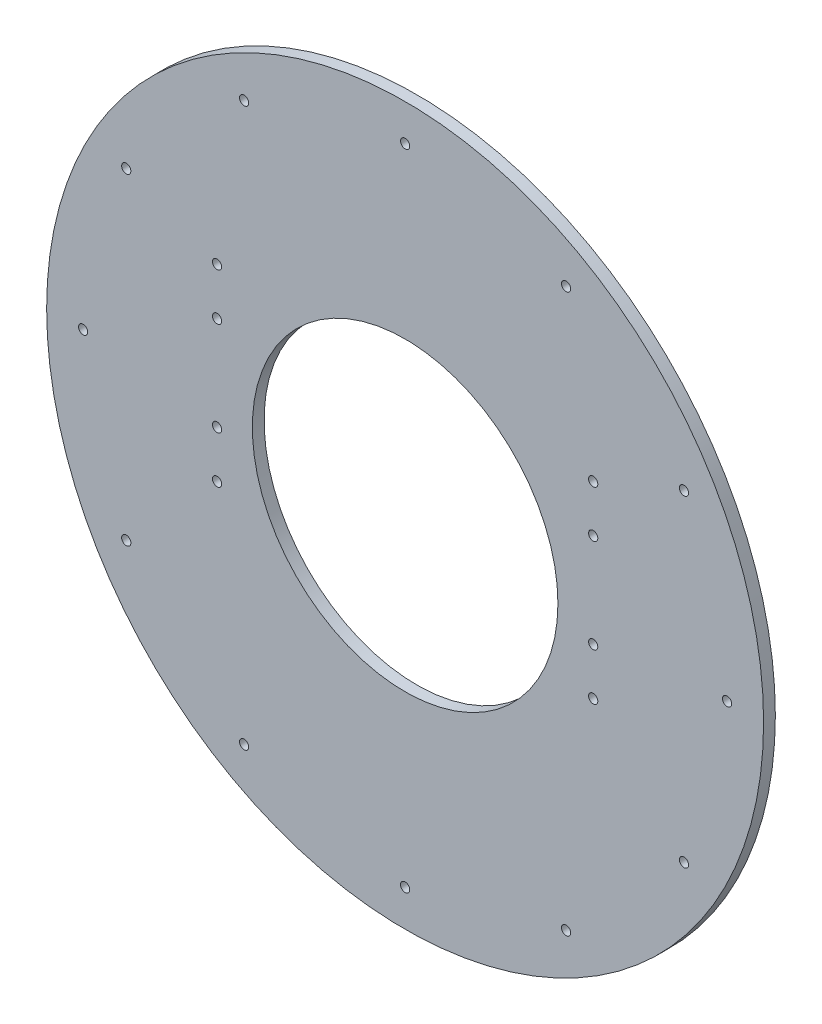
ISO-10303-21;
HEADER;
FILE_DESCRIPTION(('STEP AP214'),'2;1');
FILE_NAME('part.step','',(''),(''),'','','');
FILE_SCHEMA(('AUTOMOTIVE_DESIGN { 1 0 10303 214 1 1 1 1 }'));
ENDSEC;
DATA;
#1=APPLICATION_CONTEXT('core data for automotive mechanical design processes');
#2=APPLICATION_PROTOCOL_DEFINITION('international standard','automotive_design',2000,#1);
#3=PRODUCT_CONTEXT('',#1,'mechanical');
#4=PRODUCT('Part','Part','',(#3));
#5=PRODUCT_RELATED_PRODUCT_CATEGORY('part','',(#4));
#6=PRODUCT_DEFINITION_FORMATION('','',#4);
#7=PRODUCT_DEFINITION_CONTEXT('part definition',#1,'design');
#8=PRODUCT_DEFINITION('design','',#6,#7);
#9=PRODUCT_DEFINITION_SHAPE('','',#8);
#10=(LENGTH_UNIT() NAMED_UNIT(*) SI_UNIT(.MILLI.,.METRE.));
#11=(NAMED_UNIT(*) PLANE_ANGLE_UNIT() SI_UNIT($,.RADIAN.));
#12=(NAMED_UNIT(*) SI_UNIT($,.STERADIAN.) SOLID_ANGLE_UNIT());
#13=UNCERTAINTY_MEASURE_WITH_UNIT(LENGTH_MEASURE(1.E-05),#10,'distance_accuracy_value','');
#14=(GEOMETRIC_REPRESENTATION_CONTEXT(3) GLOBAL_UNCERTAINTY_ASSIGNED_CONTEXT((#13)) GLOBAL_UNIT_ASSIGNED_CONTEXT((#10,
#11,#12)) REPRESENTATION_CONTEXT('',''));
#15=CARTESIAN_POINT('',(0.,0.,0.));
#16=DIRECTION('',(0.,0.,1.));
#17=DIRECTION('',(1.,0.,0.));
#18=AXIS2_PLACEMENT_3D('',#15,#16,#17);
#19=CARTESIAN_POINT('',(0.,0.,6.35));
#20=DIRECTION('',(0.,0.,-1.));
#21=DIRECTION('',(-1.,0.,0.));
#22=AXIS2_PLACEMENT_3D('',#19,#20,#21);
#23=CYLINDRICAL_SURFACE('',#22,193.675);
#24=CARTESIAN_POINT('',(0.,0.,6.35));
#25=DIRECTION('',(0.,0.,1.));
#26=DIRECTION('',(1.,0.,0.));
#27=AXIS2_PLACEMENT_3D('',#24,#25,#26);
#28=CIRCLE('',#27,193.675);
#29=CARTESIAN_POINT('',(193.675,0.,6.35));
#30=VERTEX_POINT('',#29);
#31=EDGE_CURVE('E10',#30,#30,#28,.T.);
#32=ORIENTED_EDGE('',*,*,#31,.F.);
#33=EDGE_LOOP('',(#32));
#34=FACE_BOUND('',#33,.T.);
#35=CARTESIAN_POINT('',(0.,0.,0.));
#36=DIRECTION('',(0.,0.,1.));
#37=DIRECTION('',(1.,0.,0.));
#38=AXIS2_PLACEMENT_3D('',#35,#36,#37);
#39=CIRCLE('',#38,193.675);
#40=CARTESIAN_POINT('',(193.675,0.,0.));
#41=VERTEX_POINT('',#40);
#42=EDGE_CURVE('E44',#41,#41,#39,.T.);
#43=ORIENTED_EDGE('',*,*,#42,.T.);
#44=EDGE_LOOP('',(#43));
#45=FACE_BOUND('',#44,.T.);
#46=ADVANCED_FACE('F41',(#34,#45),#23,.T.);
#47=CARTESIAN_POINT('',(0.,0.,6.35));
#48=DIRECTION('',(0.,0.,1.));
#49=DIRECTION('',(1.,0.,0.));
#50=AXIS2_PLACEMENT_3D('',#47,#48,#49);
#51=PLANE('',#50);
#52=CARTESIAN_POINT('',(101.6,66.675,6.35));
#53=DIRECTION('',(0.,0.,1.));
#54=DIRECTION('',(1.,0.,0.));
#55=AXIS2_PLACEMENT_3D('',#52,#53,#54);
#56=CIRCLE('',#55,2.48919999999998);
#57=CARTESIAN_POINT('',(104.0892,66.675,6.35));
#58=VERTEX_POINT('',#57);
#59=EDGE_CURVE('E175',#58,#58,#56,.T.);
#60=ORIENTED_EDGE('',*,*,#59,.F.);
#61=EDGE_LOOP('',(#60));
#62=FACE_BOUND('',#61,.T.);
#63=CARTESIAN_POINT('',(101.6,41.275,6.35));
#64=DIRECTION('',(0.,0.,1.));
#65=DIRECTION('',(1.,0.,0.));
#66=AXIS2_PLACEMENT_3D('',#63,#64,#65);
#67=CIRCLE('',#66,2.48919999999998);
#68=CARTESIAN_POINT('',(104.0892,41.275,6.35));
#69=VERTEX_POINT('',#68);
#70=EDGE_CURVE('E169',#69,#69,#67,.T.);
#71=ORIENTED_EDGE('',*,*,#70,.F.);
#72=EDGE_LOOP('',(#71));
#73=FACE_BOUND('',#72,.T.);
#74=CARTESIAN_POINT('',(101.6,-9.52499999999996,6.35));
#75=DIRECTION('',(0.,0.,1.));
#76=DIRECTION('',(1.,0.,0.));
#77=AXIS2_PLACEMENT_3D('',#74,#75,#76);
#78=CIRCLE('',#77,2.48919999999998);
#79=CARTESIAN_POINT('',(104.0892,-9.52499999999996,6.35));
#80=VERTEX_POINT('',#79);
#81=EDGE_CURVE('E163',#80,#80,#78,.T.);
#82=ORIENTED_EDGE('',*,*,#81,.F.);
#83=EDGE_LOOP('',(#82));
#84=FACE_BOUND('',#83,.T.);
#85=CARTESIAN_POINT('',(101.6,-34.925,6.35));
#86=DIRECTION('',(0.,0.,1.));
#87=DIRECTION('',(1.,0.,0.));
#88=AXIS2_PLACEMENT_3D('',#85,#86,#87);
#89=CIRCLE('',#88,2.48919999999998);
#90=CARTESIAN_POINT('',(104.0892,-34.925,6.35));
#91=VERTEX_POINT('',#90);
#92=EDGE_CURVE('E157',#91,#91,#89,.T.);
#93=ORIENTED_EDGE('',*,*,#92,.F.);
#94=EDGE_LOOP('',(#93));
#95=FACE_BOUND('',#94,.T.);
#96=CARTESIAN_POINT('',(-101.6,-34.925,6.35));
#97=DIRECTION('',(0.,0.,1.));
#98=DIRECTION('',(1.,0.,0.));
#99=AXIS2_PLACEMENT_3D('',#96,#97,#98);
#100=CIRCLE('',#99,2.48919999999998);
#101=CARTESIAN_POINT('',(-99.1108,-34.925,6.35));
#102=VERTEX_POINT('',#101);
#103=EDGE_CURVE('E151',#102,#102,#100,.T.);
#104=ORIENTED_EDGE('',*,*,#103,.F.);
#105=EDGE_LOOP('',(#104));
#106=FACE_BOUND('',#105,.T.);
#107=CARTESIAN_POINT('',(-101.6,-9.52499999999998,6.35));
#108=DIRECTION('',(0.,0.,1.));
#109=DIRECTION('',(1.,0.,0.));
#110=AXIS2_PLACEMENT_3D('',#107,#108,#109);
#111=CIRCLE('',#110,2.48919999999998);
#112=CARTESIAN_POINT('',(-99.1108,-9.52499999999998,6.35));
#113=VERTEX_POINT('',#112);
#114=EDGE_CURVE('E145',#113,#113,#111,.T.);
#115=ORIENTED_EDGE('',*,*,#114,.F.);
#116=EDGE_LOOP('',(#115));
#117=FACE_BOUND('',#116,.T.);
#118=CARTESIAN_POINT('',(-101.6,41.275,6.35));
#119=DIRECTION('',(0.,0.,1.));
#120=DIRECTION('',(1.,0.,0.));
#121=AXIS2_PLACEMENT_3D('',#118,#119,#120);
#122=CIRCLE('',#121,2.48919999999998);
#123=CARTESIAN_POINT('',(-99.1108,41.275,6.35));
#124=VERTEX_POINT('',#123);
#125=EDGE_CURVE('E139',#124,#124,#122,.T.);
#126=ORIENTED_EDGE('',*,*,#125,.F.);
#127=EDGE_LOOP('',(#126));
#128=FACE_BOUND('',#127,.T.);
#129=CARTESIAN_POINT('',(-101.6,66.675,6.35));
#130=DIRECTION('',(0.,0.,1.));
#131=DIRECTION('',(1.,0.,0.));
#132=AXIS2_PLACEMENT_3D('',#129,#130,#131);
#133=CIRCLE('',#132,2.48919999999998);
#134=CARTESIAN_POINT('',(-99.1108,66.675,6.35));
#135=VERTEX_POINT('',#134);
#136=EDGE_CURVE('E133',#135,#135,#133,.T.);
#137=ORIENTED_EDGE('',*,*,#136,.F.);
#138=EDGE_LOOP('',(#137));
#139=FACE_BOUND('',#138,.T.);
#140=CARTESIAN_POINT('',(0.,0.,6.35));
#141=DIRECTION('',(0.,0.,1.));
#142=DIRECTION('',(1.,0.,0.));
#143=AXIS2_PLACEMENT_3D('',#140,#141,#142);
#144=CIRCLE('',#143,82.55);
#145=CARTESIAN_POINT('',(82.55,0.,6.35));
#146=VERTEX_POINT('',#145);
#147=EDGE_CURVE('E125',#146,#146,#144,.T.);
#148=ORIENTED_EDGE('',*,*,#147,.F.);
#149=EDGE_LOOP('',(#148));
#150=FACE_BOUND('',#149,.T.);
#151=CARTESIAN_POINT('',(-150.657762959198,86.9823,6.35));
#152=DIRECTION('',(0.,0.,1.));
#153=DIRECTION('',(1.,0.,0.));
#154=AXIS2_PLACEMENT_3D('',#151,#152,#153);
#155=CIRCLE('',#154,2.4892);
#156=CARTESIAN_POINT('',(-148.168562959198,86.9823,6.35));
#157=VERTEX_POINT('',#156);
#158=EDGE_CURVE('E121',#157,#157,#155,.T.);
#159=ORIENTED_EDGE('',*,*,#158,.F.);
#160=EDGE_LOOP('',(#159));
#161=FACE_BOUND('',#160,.T.);
#162=CARTESIAN_POINT('',(-173.9646,0.,6.35));
#163=DIRECTION('',(0.,0.,1.));
#164=DIRECTION('',(1.,0.,0.));
#165=AXIS2_PLACEMENT_3D('',#162,#163,#164);
#166=CIRCLE('',#165,2.4892);
#167=CARTESIAN_POINT('',(-171.4754,0.,6.35));
#168=VERTEX_POINT('',#167);
#169=EDGE_CURVE('E115',#168,#168,#166,.T.);
#170=ORIENTED_EDGE('',*,*,#169,.F.);
#171=EDGE_LOOP('',(#170));
#172=FACE_BOUND('',#171,.T.);
#173=CARTESIAN_POINT('',(-150.657762959198,-86.9823,6.35));
#174=DIRECTION('',(0.,0.,1.));
#175=DIRECTION('',(1.,0.,0.));
#176=AXIS2_PLACEMENT_3D('',#173,#174,#175);
#177=CIRCLE('',#176,2.4892);
#178=CARTESIAN_POINT('',(-148.168562959198,-86.9823,6.35));
#179=VERTEX_POINT('',#178);
#180=EDGE_CURVE('E109',#179,#179,#177,.T.);
#181=ORIENTED_EDGE('',*,*,#180,.F.);
#182=EDGE_LOOP('',(#181));
#183=FACE_BOUND('',#182,.T.);
#184=CARTESIAN_POINT('',(-86.9823,-150.657762959198,6.35));
#185=DIRECTION('',(0.,0.,1.));
#186=DIRECTION('',(1.,0.,0.));
#187=AXIS2_PLACEMENT_3D('',#184,#185,#186);
#188=CIRCLE('',#187,2.48919999999998);
#189=CARTESIAN_POINT('',(-84.4931,-150.657762959198,6.35));
#190=VERTEX_POINT('',#189);
#191=EDGE_CURVE('E103',#190,#190,#188,.T.);
#192=ORIENTED_EDGE('',*,*,#191,.F.);
#193=EDGE_LOOP('',(#192));
#194=FACE_BOUND('',#193,.T.);
#195=CARTESIAN_POINT('',(0.,-173.9646,6.35));
#196=DIRECTION('',(0.,0.,1.));
#197=DIRECTION('',(1.,0.,0.));
#198=AXIS2_PLACEMENT_3D('',#195,#196,#197);
#199=CIRCLE('',#198,2.48919999999999);
#200=CARTESIAN_POINT('',(2.48919999999996,-173.9646,6.35));
#201=VERTEX_POINT('',#200);
#202=EDGE_CURVE('E97',#201,#201,#199,.T.);
#203=ORIENTED_EDGE('',*,*,#202,.F.);
#204=EDGE_LOOP('',(#203));
#205=FACE_BOUND('',#204,.T.);
#206=CARTESIAN_POINT('',(86.9823000000001,-150.657762959198,6.35));
#207=DIRECTION('',(0.,0.,1.));
#208=DIRECTION('',(1.,0.,0.));
#209=AXIS2_PLACEMENT_3D('',#206,#207,#208);
#210=CIRCLE('',#209,2.48919999999998);
#211=CARTESIAN_POINT('',(89.4715000000001,-150.657762959198,6.35));
#212=VERTEX_POINT('',#211);
#213=EDGE_CURVE('E91',#212,#212,#210,.T.);
#214=ORIENTED_EDGE('',*,*,#213,.F.);
#215=EDGE_LOOP('',(#214));
#216=FACE_BOUND('',#215,.T.);
#217=CARTESIAN_POINT('',(150.657762959198,-86.9823,6.35));
#218=DIRECTION('',(0.,0.,1.));
#219=DIRECTION('',(1.,0.,0.));
#220=AXIS2_PLACEMENT_3D('',#217,#218,#219);
#221=CIRCLE('',#220,2.4892);
#222=CARTESIAN_POINT('',(153.146962959198,-86.9823,6.35));
#223=VERTEX_POINT('',#222);
#224=EDGE_CURVE('E85',#223,#223,#221,.T.);
#225=ORIENTED_EDGE('',*,*,#224,.F.);
#226=EDGE_LOOP('',(#225));
#227=FACE_BOUND('',#226,.T.);
#228=CARTESIAN_POINT('',(173.9646,0.,6.35));
#229=DIRECTION('',(0.,0.,1.));
#230=DIRECTION('',(1.,0.,0.));
#231=AXIS2_PLACEMENT_3D('',#228,#229,#230);
#232=CIRCLE('',#231,2.4892);
#233=CARTESIAN_POINT('',(176.4538,0.,6.35));
#234=VERTEX_POINT('',#233);
#235=EDGE_CURVE('E79',#234,#234,#232,.T.);
#236=ORIENTED_EDGE('',*,*,#235,.F.);
#237=EDGE_LOOP('',(#236));
#238=FACE_BOUND('',#237,.T.);
#239=CARTESIAN_POINT('',(150.657762959198,86.9823,6.35));
#240=DIRECTION('',(0.,0.,1.));
#241=DIRECTION('',(1.,0.,0.));
#242=AXIS2_PLACEMENT_3D('',#239,#240,#241);
#243=CIRCLE('',#242,2.4892);
#244=CARTESIAN_POINT('',(153.146962959198,86.9823,6.35));
#245=VERTEX_POINT('',#244);
#246=EDGE_CURVE('E73',#245,#245,#243,.T.);
#247=ORIENTED_EDGE('',*,*,#246,.F.);
#248=EDGE_LOOP('',(#247));
#249=FACE_BOUND('',#248,.T.);
#250=CARTESIAN_POINT('',(86.9823,150.657762959198,6.35));
#251=DIRECTION('',(0.,0.,1.));
#252=DIRECTION('',(1.,0.,0.));
#253=AXIS2_PLACEMENT_3D('',#250,#251,#252);
#254=CIRCLE('',#253,2.48919999999998);
#255=CARTESIAN_POINT('',(89.4715,150.657762959198,6.35));
#256=VERTEX_POINT('',#255);
#257=EDGE_CURVE('E67',#256,#256,#254,.T.);
#258=ORIENTED_EDGE('',*,*,#257,.F.);
#259=EDGE_LOOP('',(#258));
#260=FACE_BOUND('',#259,.T.);
#261=CARTESIAN_POINT('',(0.,173.9646,6.35));
#262=DIRECTION('',(0.,0.,1.));
#263=DIRECTION('',(1.,0.,0.));
#264=AXIS2_PLACEMENT_3D('',#261,#262,#263);
#265=CIRCLE('',#264,2.48919999999999);
#266=CARTESIAN_POINT('',(2.48919999999995,173.9646,6.35));
#267=VERTEX_POINT('',#266);
#268=EDGE_CURVE('E61',#267,#267,#265,.T.);
#269=ORIENTED_EDGE('',*,*,#268,.F.);
#270=EDGE_LOOP('',(#269));
#271=FACE_BOUND('',#270,.T.);
#272=CARTESIAN_POINT('',(-86.9823,150.657762959198,6.35));
#273=DIRECTION('',(0.,0.,1.));
#274=DIRECTION('',(1.,0.,0.));
#275=AXIS2_PLACEMENT_3D('',#272,#273,#274);
#276=CIRCLE('',#275,2.48919999999998);
#277=CARTESIAN_POINT('',(-84.4931,150.657762959198,6.35));
#278=VERTEX_POINT('',#277);
#279=EDGE_CURVE('E55',#278,#278,#276,.T.);
#280=ORIENTED_EDGE('',*,*,#279,.F.);
#281=EDGE_LOOP('',(#280));
#282=FACE_BOUND('',#281,.T.);
#283=ORIENTED_EDGE('',*,*,#31,.T.);
#284=EDGE_LOOP('',(#283));
#285=FACE_BOUND('',#284,.T.);
#286=ADVANCED_FACE('F181',(#62,#73,#84,#95,#106,#117,#128,#139,#150,#161,#172,#183,#194,#205,
#216,#227,#238,#249,#260,#271,#282,#285),#51,.T.);
#287=CARTESIAN_POINT('',(0.,0.,0.));
#288=DIRECTION('',(0.,0.,1.));
#289=DIRECTION('',(1.,0.,0.));
#290=AXIS2_PLACEMENT_3D('',#287,#288,#289);
#291=PLANE('',#290);
#292=CARTESIAN_POINT('',(101.6,66.675,0.));
#293=DIRECTION('',(0.,0.,1.));
#294=DIRECTION('',(1.,0.,0.));
#295=AXIS2_PLACEMENT_3D('',#292,#293,#294);
#296=CIRCLE('',#295,2.48919999999998);
#297=CARTESIAN_POINT('',(104.0892,66.675,0.));
#298=VERTEX_POINT('',#297);
#299=EDGE_CURVE('E172',#298,#298,#296,.T.);
#300=ORIENTED_EDGE('',*,*,#299,.T.);
#301=EDGE_LOOP('',(#300));
#302=FACE_BOUND('',#301,.T.);
#303=CARTESIAN_POINT('',(101.6,41.275,0.));
#304=DIRECTION('',(0.,0.,1.));
#305=DIRECTION('',(1.,0.,0.));
#306=AXIS2_PLACEMENT_3D('',#303,#304,#305);
#307=CIRCLE('',#306,2.48919999999998);
#308=CARTESIAN_POINT('',(104.0892,41.275,0.));
#309=VERTEX_POINT('',#308);
#310=EDGE_CURVE('E166',#309,#309,#307,.T.);
#311=ORIENTED_EDGE('',*,*,#310,.T.);
#312=EDGE_LOOP('',(#311));
#313=FACE_BOUND('',#312,.T.);
#314=CARTESIAN_POINT('',(101.6,-9.52499999999996,0.));
#315=DIRECTION('',(0.,0.,1.));
#316=DIRECTION('',(1.,0.,0.));
#317=AXIS2_PLACEMENT_3D('',#314,#315,#316);
#318=CIRCLE('',#317,2.48919999999998);
#319=CARTESIAN_POINT('',(104.0892,-9.52499999999996,0.));
#320=VERTEX_POINT('',#319);
#321=EDGE_CURVE('E160',#320,#320,#318,.T.);
#322=ORIENTED_EDGE('',*,*,#321,.T.);
#323=EDGE_LOOP('',(#322));
#324=FACE_BOUND('',#323,.T.);
#325=CARTESIAN_POINT('',(101.6,-34.925,0.));
#326=DIRECTION('',(0.,0.,1.));
#327=DIRECTION('',(1.,0.,0.));
#328=AXIS2_PLACEMENT_3D('',#325,#326,#327);
#329=CIRCLE('',#328,2.48919999999998);
#330=CARTESIAN_POINT('',(104.0892,-34.925,0.));
#331=VERTEX_POINT('',#330);
#332=EDGE_CURVE('E154',#331,#331,#329,.T.);
#333=ORIENTED_EDGE('',*,*,#332,.T.);
#334=EDGE_LOOP('',(#333));
#335=FACE_BOUND('',#334,.T.);
#336=CARTESIAN_POINT('',(-101.6,-34.925,0.));
#337=DIRECTION('',(0.,0.,1.));
#338=DIRECTION('',(1.,0.,0.));
#339=AXIS2_PLACEMENT_3D('',#336,#337,#338);
#340=CIRCLE('',#339,2.48919999999998);
#341=CARTESIAN_POINT('',(-99.1108,-34.925,0.));
#342=VERTEX_POINT('',#341);
#343=EDGE_CURVE('E148',#342,#342,#340,.T.);
#344=ORIENTED_EDGE('',*,*,#343,.T.);
#345=EDGE_LOOP('',(#344));
#346=FACE_BOUND('',#345,.T.);
#347=CARTESIAN_POINT('',(-101.6,-9.52499999999998,0.));
#348=DIRECTION('',(0.,0.,1.));
#349=DIRECTION('',(1.,0.,0.));
#350=AXIS2_PLACEMENT_3D('',#347,#348,#349);
#351=CIRCLE('',#350,2.48919999999998);
#352=CARTESIAN_POINT('',(-99.1108,-9.52499999999998,0.));
#353=VERTEX_POINT('',#352);
#354=EDGE_CURVE('E142',#353,#353,#351,.T.);
#355=ORIENTED_EDGE('',*,*,#354,.T.);
#356=EDGE_LOOP('',(#355));
#357=FACE_BOUND('',#356,.T.);
#358=CARTESIAN_POINT('',(-101.6,41.275,0.));
#359=DIRECTION('',(0.,0.,1.));
#360=DIRECTION('',(1.,0.,0.));
#361=AXIS2_PLACEMENT_3D('',#358,#359,#360);
#362=CIRCLE('',#361,2.48919999999998);
#363=CARTESIAN_POINT('',(-99.1108,41.275,0.));
#364=VERTEX_POINT('',#363);
#365=EDGE_CURVE('E136',#364,#364,#362,.T.);
#366=ORIENTED_EDGE('',*,*,#365,.T.);
#367=EDGE_LOOP('',(#366));
#368=FACE_BOUND('',#367,.T.);
#369=CARTESIAN_POINT('',(-101.6,66.675,0.));
#370=DIRECTION('',(0.,0.,1.));
#371=DIRECTION('',(1.,0.,0.));
#372=AXIS2_PLACEMENT_3D('',#369,#370,#371);
#373=CIRCLE('',#372,2.48919999999998);
#374=CARTESIAN_POINT('',(-99.1108,66.675,0.));
#375=VERTEX_POINT('',#374);
#376=EDGE_CURVE('E128',#375,#375,#373,.T.);
#377=ORIENTED_EDGE('',*,*,#376,.T.);
#378=EDGE_LOOP('',(#377));
#379=FACE_BOUND('',#378,.T.);
#380=CARTESIAN_POINT('',(0.,0.,0.));
#381=DIRECTION('',(0.,0.,1.));
#382=DIRECTION('',(1.,0.,0.));
#383=AXIS2_PLACEMENT_3D('',#380,#381,#382);
#384=CIRCLE('',#383,82.55);
#385=CARTESIAN_POINT('',(82.55,0.,0.));
#386=VERTEX_POINT('',#385);
#387=EDGE_CURVE('E124',#386,#386,#384,.T.);
#388=ORIENTED_EDGE('',*,*,#387,.T.);
#389=EDGE_LOOP('',(#388));
#390=FACE_BOUND('',#389,.T.);
#391=CARTESIAN_POINT('',(-150.657762959198,86.9823,0.));
#392=DIRECTION('',(0.,0.,1.));
#393=DIRECTION('',(1.,0.,0.));
#394=AXIS2_PLACEMENT_3D('',#391,#392,#393);
#395=CIRCLE('',#394,2.4892);
#396=CARTESIAN_POINT('',(-148.168562959198,86.9823,0.));
#397=VERTEX_POINT('',#396);
#398=EDGE_CURVE('E118',#397,#397,#395,.T.);
#399=ORIENTED_EDGE('',*,*,#398,.T.);
#400=EDGE_LOOP('',(#399));
#401=FACE_BOUND('',#400,.T.);
#402=CARTESIAN_POINT('',(-173.9646,0.,0.));
#403=DIRECTION('',(0.,0.,1.));
#404=DIRECTION('',(1.,0.,0.));
#405=AXIS2_PLACEMENT_3D('',#402,#403,#404);
#406=CIRCLE('',#405,2.4892);
#407=CARTESIAN_POINT('',(-171.4754,0.,0.));
#408=VERTEX_POINT('',#407);
#409=EDGE_CURVE('E112',#408,#408,#406,.T.);
#410=ORIENTED_EDGE('',*,*,#409,.T.);
#411=EDGE_LOOP('',(#410));
#412=FACE_BOUND('',#411,.T.);
#413=CARTESIAN_POINT('',(-150.657762959198,-86.9823,0.));
#414=DIRECTION('',(0.,0.,1.));
#415=DIRECTION('',(1.,0.,0.));
#416=AXIS2_PLACEMENT_3D('',#413,#414,#415);
#417=CIRCLE('',#416,2.4892);
#418=CARTESIAN_POINT('',(-148.168562959198,-86.9823,0.));
#419=VERTEX_POINT('',#418);
#420=EDGE_CURVE('E106',#419,#419,#417,.T.);
#421=ORIENTED_EDGE('',*,*,#420,.T.);
#422=EDGE_LOOP('',(#421));
#423=FACE_BOUND('',#422,.T.);
#424=CARTESIAN_POINT('',(-86.9823,-150.657762959198,0.));
#425=DIRECTION('',(0.,0.,1.));
#426=DIRECTION('',(1.,0.,0.));
#427=AXIS2_PLACEMENT_3D('',#424,#425,#426);
#428=CIRCLE('',#427,2.4892);
#429=CARTESIAN_POINT('',(-84.4931,-150.657762959198,0.));
#430=VERTEX_POINT('',#429);
#431=EDGE_CURVE('E100',#430,#430,#428,.T.);
#432=ORIENTED_EDGE('',*,*,#431,.T.);
#433=EDGE_LOOP('',(#432));
#434=FACE_BOUND('',#433,.T.);
#435=CARTESIAN_POINT('',(0.,-173.9646,0.));
#436=DIRECTION('',(0.,0.,1.));
#437=DIRECTION('',(1.,0.,0.));
#438=AXIS2_PLACEMENT_3D('',#435,#436,#437);
#439=CIRCLE('',#438,2.4892);
#440=CARTESIAN_POINT('',(2.48919999999997,-173.9646,0.));
#441=VERTEX_POINT('',#440);
#442=EDGE_CURVE('E94',#441,#441,#439,.T.);
#443=ORIENTED_EDGE('',*,*,#442,.T.);
#444=EDGE_LOOP('',(#443));
#445=FACE_BOUND('',#444,.T.);
#446=CARTESIAN_POINT('',(86.9823000000001,-150.657762959198,0.));
#447=DIRECTION('',(0.,0.,1.));
#448=DIRECTION('',(1.,0.,0.));
#449=AXIS2_PLACEMENT_3D('',#446,#447,#448);
#450=CIRCLE('',#449,2.4892);
#451=CARTESIAN_POINT('',(89.4715000000001,-150.657762959198,0.));
#452=VERTEX_POINT('',#451);
#453=EDGE_CURVE('E88',#452,#452,#450,.T.);
#454=ORIENTED_EDGE('',*,*,#453,.T.);
#455=EDGE_LOOP('',(#454));
#456=FACE_BOUND('',#455,.T.);
#457=CARTESIAN_POINT('',(150.657762959198,-86.9823,0.));
#458=DIRECTION('',(0.,0.,1.));
#459=DIRECTION('',(1.,0.,0.));
#460=AXIS2_PLACEMENT_3D('',#457,#458,#459);
#461=CIRCLE('',#460,2.4892);
#462=CARTESIAN_POINT('',(153.146962959198,-86.9823,0.));
#463=VERTEX_POINT('',#462);
#464=EDGE_CURVE('E82',#463,#463,#461,.T.);
#465=ORIENTED_EDGE('',*,*,#464,.T.);
#466=EDGE_LOOP('',(#465));
#467=FACE_BOUND('',#466,.T.);
#468=CARTESIAN_POINT('',(173.9646,0.,0.));
#469=DIRECTION('',(0.,0.,1.));
#470=DIRECTION('',(1.,0.,0.));
#471=AXIS2_PLACEMENT_3D('',#468,#469,#470);
#472=CIRCLE('',#471,2.4892);
#473=CARTESIAN_POINT('',(176.4538,0.,0.));
#474=VERTEX_POINT('',#473);
#475=EDGE_CURVE('E76',#474,#474,#472,.T.);
#476=ORIENTED_EDGE('',*,*,#475,.T.);
#477=EDGE_LOOP('',(#476));
#478=FACE_BOUND('',#477,.T.);
#479=CARTESIAN_POINT('',(150.657762959198,86.9823,0.));
#480=DIRECTION('',(0.,0.,1.));
#481=DIRECTION('',(1.,0.,0.));
#482=AXIS2_PLACEMENT_3D('',#479,#480,#481);
#483=CIRCLE('',#482,2.4892);
#484=CARTESIAN_POINT('',(153.146962959198,86.9823,0.));
#485=VERTEX_POINT('',#484);
#486=EDGE_CURVE('E70',#485,#485,#483,.T.);
#487=ORIENTED_EDGE('',*,*,#486,.T.);
#488=EDGE_LOOP('',(#487));
#489=FACE_BOUND('',#488,.T.);
#490=CARTESIAN_POINT('',(86.9823,150.657762959198,0.));
#491=DIRECTION('',(0.,0.,1.));
#492=DIRECTION('',(1.,0.,0.));
#493=AXIS2_PLACEMENT_3D('',#490,#491,#492);
#494=CIRCLE('',#493,2.4892);
#495=CARTESIAN_POINT('',(89.4715,150.657762959198,0.));
#496=VERTEX_POINT('',#495);
#497=EDGE_CURVE('E64',#496,#496,#494,.T.);
#498=ORIENTED_EDGE('',*,*,#497,.T.);
#499=EDGE_LOOP('',(#498));
#500=FACE_BOUND('',#499,.T.);
#501=CARTESIAN_POINT('',(0.,173.9646,0.));
#502=DIRECTION('',(0.,0.,1.));
#503=DIRECTION('',(1.,0.,0.));
#504=AXIS2_PLACEMENT_3D('',#501,#502,#503);
#505=CIRCLE('',#504,2.4892);
#506=CARTESIAN_POINT('',(2.48919999999995,173.9646,0.));
#507=VERTEX_POINT('',#506);
#508=EDGE_CURVE('E58',#507,#507,#505,.T.);
#509=ORIENTED_EDGE('',*,*,#508,.T.);
#510=EDGE_LOOP('',(#509));
#511=FACE_BOUND('',#510,.T.);
#512=CARTESIAN_POINT('',(-86.9823,150.657762959198,0.));
#513=DIRECTION('',(0.,0.,1.));
#514=DIRECTION('',(1.,0.,0.));
#515=AXIS2_PLACEMENT_3D('',#512,#513,#514);
#516=CIRCLE('',#515,2.4892);
#517=CARTESIAN_POINT('',(-84.4931,150.657762959198,0.));
#518=VERTEX_POINT('',#517);
#519=EDGE_CURVE('E51',#518,#518,#516,.T.);
#520=ORIENTED_EDGE('',*,*,#519,.T.);
#521=EDGE_LOOP('',(#520));
#522=FACE_BOUND('',#521,.T.);
#523=ORIENTED_EDGE('',*,*,#42,.F.);
#524=EDGE_LOOP('',(#523));
#525=FACE_BOUND('',#524,.T.);
#526=ADVANCED_FACE('F184',(#302,#313,#324,#335,#346,#357,#368,#379,#390,#401,#412,#423,#434,
#445,#456,#467,#478,#489,#500,#511,#522,#525),#291,.F.);
#527=CARTESIAN_POINT('',(-86.9823,150.657762959198,6.35));
#528=DIRECTION('',(0.,0.,1.));
#529=DIRECTION('',(1.,0.,0.));
#530=AXIS2_PLACEMENT_3D('',#527,#528,#529);
#531=CYLINDRICAL_SURFACE('',#530,2.48919999999999);
#532=ORIENTED_EDGE('',*,*,#519,.F.);
#533=EDGE_LOOP('',(#532));
#534=FACE_BOUND('',#533,.T.);
#535=ORIENTED_EDGE('',*,*,#279,.T.);
#536=EDGE_LOOP('',(#535));
#537=FACE_BOUND('',#536,.T.);
#538=ADVANCED_FACE('F226',(#534,#537),#531,.F.);
#539=CARTESIAN_POINT('',(0.,173.9646,6.35));
#540=DIRECTION('',(0.,0.,1.));
#541=DIRECTION('',(1.,0.,0.));
#542=AXIS2_PLACEMENT_3D('',#539,#540,#541);
#543=CYLINDRICAL_SURFACE('',#542,2.48919999999999);
#544=ORIENTED_EDGE('',*,*,#508,.F.);
#545=EDGE_LOOP('',(#544));
#546=FACE_BOUND('',#545,.T.);
#547=ORIENTED_EDGE('',*,*,#268,.T.);
#548=EDGE_LOOP('',(#547));
#549=FACE_BOUND('',#548,.T.);
#550=ADVANCED_FACE('F228',(#546,#549),#543,.F.);
#551=CARTESIAN_POINT('',(86.9823,150.657762959198,6.35));
#552=DIRECTION('',(0.,0.,1.));
#553=DIRECTION('',(1.,0.,0.));
#554=AXIS2_PLACEMENT_3D('',#551,#552,#553);
#555=CYLINDRICAL_SURFACE('',#554,2.48919999999999);
#556=ORIENTED_EDGE('',*,*,#497,.F.);
#557=EDGE_LOOP('',(#556));
#558=FACE_BOUND('',#557,.T.);
#559=ORIENTED_EDGE('',*,*,#257,.T.);
#560=EDGE_LOOP('',(#559));
#561=FACE_BOUND('',#560,.T.);
#562=ADVANCED_FACE('F235',(#558,#561),#555,.F.);
#563=CARTESIAN_POINT('',(150.657762959198,86.9823,6.35));
#564=DIRECTION('',(0.,0.,1.));
#565=DIRECTION('',(1.,0.,0.));
#566=AXIS2_PLACEMENT_3D('',#563,#564,#565);
#567=CYLINDRICAL_SURFACE('',#566,2.4892);
#568=ORIENTED_EDGE('',*,*,#486,.F.);
#569=EDGE_LOOP('',(#568));
#570=FACE_BOUND('',#569,.T.);
#571=ORIENTED_EDGE('',*,*,#246,.T.);
#572=EDGE_LOOP('',(#571));
#573=FACE_BOUND('',#572,.T.);
#574=ADVANCED_FACE('F281',(#570,#573),#567,.F.);
#575=CARTESIAN_POINT('',(173.9646,0.,6.35));
#576=DIRECTION('',(0.,0.,1.));
#577=DIRECTION('',(1.,0.,0.));
#578=AXIS2_PLACEMENT_3D('',#575,#576,#577);
#579=CYLINDRICAL_SURFACE('',#578,2.4892);
#580=ORIENTED_EDGE('',*,*,#475,.F.);
#581=EDGE_LOOP('',(#580));
#582=FACE_BOUND('',#581,.T.);
#583=ORIENTED_EDGE('',*,*,#235,.T.);
#584=EDGE_LOOP('',(#583));
#585=FACE_BOUND('',#584,.T.);
#586=ADVANCED_FACE('F291',(#582,#585),#579,.F.);
#587=CARTESIAN_POINT('',(150.657762959198,-86.9823,6.35));
#588=DIRECTION('',(0.,0.,1.));
#589=DIRECTION('',(1.,0.,0.));
#590=AXIS2_PLACEMENT_3D('',#587,#588,#589);
#591=CYLINDRICAL_SURFACE('',#590,2.4892);
#592=ORIENTED_EDGE('',*,*,#464,.F.);
#593=EDGE_LOOP('',(#592));
#594=FACE_BOUND('',#593,.T.);
#595=ORIENTED_EDGE('',*,*,#224,.T.);
#596=EDGE_LOOP('',(#595));
#597=FACE_BOUND('',#596,.T.);
#598=ADVANCED_FACE('F301',(#594,#597),#591,.F.);
#599=CARTESIAN_POINT('',(86.9823000000001,-150.657762959198,6.35));
#600=DIRECTION('',(0.,0.,1.));
#601=DIRECTION('',(1.,0.,0.));
#602=AXIS2_PLACEMENT_3D('',#599,#600,#601);
#603=CYLINDRICAL_SURFACE('',#602,2.48919999999999);
#604=ORIENTED_EDGE('',*,*,#453,.F.);
#605=EDGE_LOOP('',(#604));
#606=FACE_BOUND('',#605,.T.);
#607=ORIENTED_EDGE('',*,*,#213,.T.);
#608=EDGE_LOOP('',(#607));
#609=FACE_BOUND('',#608,.T.);
#610=ADVANCED_FACE('F311',(#606,#609),#603,.F.);
#611=CARTESIAN_POINT('',(0.,-173.9646,6.35));
#612=DIRECTION('',(0.,0.,1.));
#613=DIRECTION('',(1.,0.,0.));
#614=AXIS2_PLACEMENT_3D('',#611,#612,#613);
#615=CYLINDRICAL_SURFACE('',#614,2.48919999999999);
#616=ORIENTED_EDGE('',*,*,#442,.F.);
#617=EDGE_LOOP('',(#616));
#618=FACE_BOUND('',#617,.T.);
#619=ORIENTED_EDGE('',*,*,#202,.T.);
#620=EDGE_LOOP('',(#619));
#621=FACE_BOUND('',#620,.T.);
#622=ADVANCED_FACE('F321',(#618,#621),#615,.F.);
#623=CARTESIAN_POINT('',(-86.9823,-150.657762959198,6.35));
#624=DIRECTION('',(0.,0.,1.));
#625=DIRECTION('',(1.,0.,0.));
#626=AXIS2_PLACEMENT_3D('',#623,#624,#625);
#627=CYLINDRICAL_SURFACE('',#626,2.48919999999999);
#628=ORIENTED_EDGE('',*,*,#431,.F.);
#629=EDGE_LOOP('',(#628));
#630=FACE_BOUND('',#629,.T.);
#631=ORIENTED_EDGE('',*,*,#191,.T.);
#632=EDGE_LOOP('',(#631));
#633=FACE_BOUND('',#632,.T.);
#634=ADVANCED_FACE('F331',(#630,#633),#627,.F.);
#635=CARTESIAN_POINT('',(-150.657762959198,-86.9823,6.35));
#636=DIRECTION('',(0.,0.,1.));
#637=DIRECTION('',(1.,0.,0.));
#638=AXIS2_PLACEMENT_3D('',#635,#636,#637);
#639=CYLINDRICAL_SURFACE('',#638,2.4892);
#640=ORIENTED_EDGE('',*,*,#420,.F.);
#641=EDGE_LOOP('',(#640));
#642=FACE_BOUND('',#641,.T.);
#643=ORIENTED_EDGE('',*,*,#180,.T.);
#644=EDGE_LOOP('',(#643));
#645=FACE_BOUND('',#644,.T.);
#646=ADVANCED_FACE('F341',(#642,#645),#639,.F.);
#647=CARTESIAN_POINT('',(-173.9646,0.,6.35));
#648=DIRECTION('',(0.,0.,1.));
#649=DIRECTION('',(1.,0.,0.));
#650=AXIS2_PLACEMENT_3D('',#647,#648,#649);
#651=CYLINDRICAL_SURFACE('',#650,2.4892);
#652=ORIENTED_EDGE('',*,*,#409,.F.);
#653=EDGE_LOOP('',(#652));
#654=FACE_BOUND('',#653,.T.);
#655=ORIENTED_EDGE('',*,*,#169,.T.);
#656=EDGE_LOOP('',(#655));
#657=FACE_BOUND('',#656,.T.);
#658=ADVANCED_FACE('F351',(#654,#657),#651,.F.);
#659=CARTESIAN_POINT('',(-150.657762959198,86.9823,6.35));
#660=DIRECTION('',(0.,0.,1.));
#661=DIRECTION('',(1.,0.,0.));
#662=AXIS2_PLACEMENT_3D('',#659,#660,#661);
#663=CYLINDRICAL_SURFACE('',#662,2.4892);
#664=ORIENTED_EDGE('',*,*,#398,.F.);
#665=EDGE_LOOP('',(#664));
#666=FACE_BOUND('',#665,.T.);
#667=ORIENTED_EDGE('',*,*,#158,.T.);
#668=EDGE_LOOP('',(#667));
#669=FACE_BOUND('',#668,.T.);
#670=ADVANCED_FACE('F361',(#666,#669),#663,.F.);
#671=CARTESIAN_POINT('',(0.,0.,0.));
#672=DIRECTION('',(0.,0.,1.));
#673=DIRECTION('',(1.,0.,0.));
#674=AXIS2_PLACEMENT_3D('',#671,#672,#673);
#675=CYLINDRICAL_SURFACE('',#674,82.55);
#676=ORIENTED_EDGE('',*,*,#387,.F.);
#677=EDGE_LOOP('',(#676));
#678=FACE_BOUND('',#677,.T.);
#679=ORIENTED_EDGE('',*,*,#147,.T.);
#680=EDGE_LOOP('',(#679));
#681=FACE_BOUND('',#680,.T.);
#682=ADVANCED_FACE('F371',(#678,#681),#675,.F.);
#683=CARTESIAN_POINT('',(-101.6,66.675,6.35));
#684=DIRECTION('',(0.,0.,1.));
#685=DIRECTION('',(1.,0.,0.));
#686=AXIS2_PLACEMENT_3D('',#683,#684,#685);
#687=CYLINDRICAL_SURFACE('',#686,2.48919999999998);
#688=ORIENTED_EDGE('',*,*,#376,.F.);
#689=EDGE_LOOP('',(#688));
#690=FACE_BOUND('',#689,.T.);
#691=ORIENTED_EDGE('',*,*,#136,.T.);
#692=EDGE_LOOP('',(#691));
#693=FACE_BOUND('',#692,.T.);
#694=ADVANCED_FACE('F380',(#690,#693),#687,.F.);
#695=CARTESIAN_POINT('',(-101.6,41.275,6.35));
#696=DIRECTION('',(0.,0.,1.));
#697=DIRECTION('',(1.,0.,0.));
#698=AXIS2_PLACEMENT_3D('',#695,#696,#697);
#699=CYLINDRICAL_SURFACE('',#698,2.48919999999998);
#700=ORIENTED_EDGE('',*,*,#365,.F.);
#701=EDGE_LOOP('',(#700));
#702=FACE_BOUND('',#701,.T.);
#703=ORIENTED_EDGE('',*,*,#125,.T.);
#704=EDGE_LOOP('',(#703));
#705=FACE_BOUND('',#704,.T.);
#706=ADVANCED_FACE('F389',(#702,#705),#699,.F.);
#707=CARTESIAN_POINT('',(-101.6,-9.52499999999998,6.35));
#708=DIRECTION('',(0.,0.,1.));
#709=DIRECTION('',(1.,0.,0.));
#710=AXIS2_PLACEMENT_3D('',#707,#708,#709);
#711=CYLINDRICAL_SURFACE('',#710,2.48919999999998);
#712=ORIENTED_EDGE('',*,*,#354,.F.);
#713=EDGE_LOOP('',(#712));
#714=FACE_BOUND('',#713,.T.);
#715=ORIENTED_EDGE('',*,*,#114,.T.);
#716=EDGE_LOOP('',(#715));
#717=FACE_BOUND('',#716,.T.);
#718=ADVANCED_FACE('F399',(#714,#717),#711,.F.);
#719=CARTESIAN_POINT('',(-101.6,-34.925,6.35));
#720=DIRECTION('',(0.,0.,1.));
#721=DIRECTION('',(1.,0.,0.));
#722=AXIS2_PLACEMENT_3D('',#719,#720,#721);
#723=CYLINDRICAL_SURFACE('',#722,2.48919999999998);
#724=ORIENTED_EDGE('',*,*,#343,.F.);
#725=EDGE_LOOP('',(#724));
#726=FACE_BOUND('',#725,.T.);
#727=ORIENTED_EDGE('',*,*,#103,.T.);
#728=EDGE_LOOP('',(#727));
#729=FACE_BOUND('',#728,.T.);
#730=ADVANCED_FACE('F409',(#726,#729),#723,.F.);
#731=CARTESIAN_POINT('',(101.6,-34.925,6.35));
#732=DIRECTION('',(0.,0.,1.));
#733=DIRECTION('',(1.,0.,0.));
#734=AXIS2_PLACEMENT_3D('',#731,#732,#733);
#735=CYLINDRICAL_SURFACE('',#734,2.48919999999998);
#736=ORIENTED_EDGE('',*,*,#332,.F.);
#737=EDGE_LOOP('',(#736));
#738=FACE_BOUND('',#737,.T.);
#739=ORIENTED_EDGE('',*,*,#92,.T.);
#740=EDGE_LOOP('',(#739));
#741=FACE_BOUND('',#740,.T.);
#742=ADVANCED_FACE('F419',(#738,#741),#735,.F.);
#743=CARTESIAN_POINT('',(101.6,-9.52499999999996,6.35));
#744=DIRECTION('',(0.,0.,1.));
#745=DIRECTION('',(1.,0.,0.));
#746=AXIS2_PLACEMENT_3D('',#743,#744,#745);
#747=CYLINDRICAL_SURFACE('',#746,2.48919999999998);
#748=ORIENTED_EDGE('',*,*,#321,.F.);
#749=EDGE_LOOP('',(#748));
#750=FACE_BOUND('',#749,.T.);
#751=ORIENTED_EDGE('',*,*,#81,.T.);
#752=EDGE_LOOP('',(#751));
#753=FACE_BOUND('',#752,.T.);
#754=ADVANCED_FACE('F429',(#750,#753),#747,.F.);
#755=CARTESIAN_POINT('',(101.6,41.275,6.35));
#756=DIRECTION('',(0.,0.,1.));
#757=DIRECTION('',(1.,0.,0.));
#758=AXIS2_PLACEMENT_3D('',#755,#756,#757);
#759=CYLINDRICAL_SURFACE('',#758,2.48919999999998);
#760=ORIENTED_EDGE('',*,*,#310,.F.);
#761=EDGE_LOOP('',(#760));
#762=FACE_BOUND('',#761,.T.);
#763=ORIENTED_EDGE('',*,*,#70,.T.);
#764=EDGE_LOOP('',(#763));
#765=FACE_BOUND('',#764,.T.);
#766=ADVANCED_FACE('F439',(#762,#765),#759,.F.);
#767=CARTESIAN_POINT('',(101.6,66.675,6.35));
#768=DIRECTION('',(0.,0.,1.));
#769=DIRECTION('',(1.,0.,0.));
#770=AXIS2_PLACEMENT_3D('',#767,#768,#769);
#771=CYLINDRICAL_SURFACE('',#770,2.48919999999998);
#772=ORIENTED_EDGE('',*,*,#299,.F.);
#773=EDGE_LOOP('',(#772));
#774=FACE_BOUND('',#773,.T.);
#775=ORIENTED_EDGE('',*,*,#59,.T.);
#776=EDGE_LOOP('',(#775));
#777=FACE_BOUND('',#776,.T.);
#778=ADVANCED_FACE('F179',(#774,#777),#771,.F.);
#779=CLOSED_SHELL('',(#46,#286,#526,#538,#550,#562,#574,#586,#598,#610,#622,#634,#646,#658,#670,
#682,#694,#706,#718,#730,#742,#754,#766,#778));
#780=MANIFOLD_SOLID_BREP('B2',#779);
#781=ADVANCED_BREP_SHAPE_REPRESENTATION('',(#18,#780),#14);
#782=SHAPE_DEFINITION_REPRESENTATION(#9,#781);
ENDSEC;
END-ISO-10303-21;
